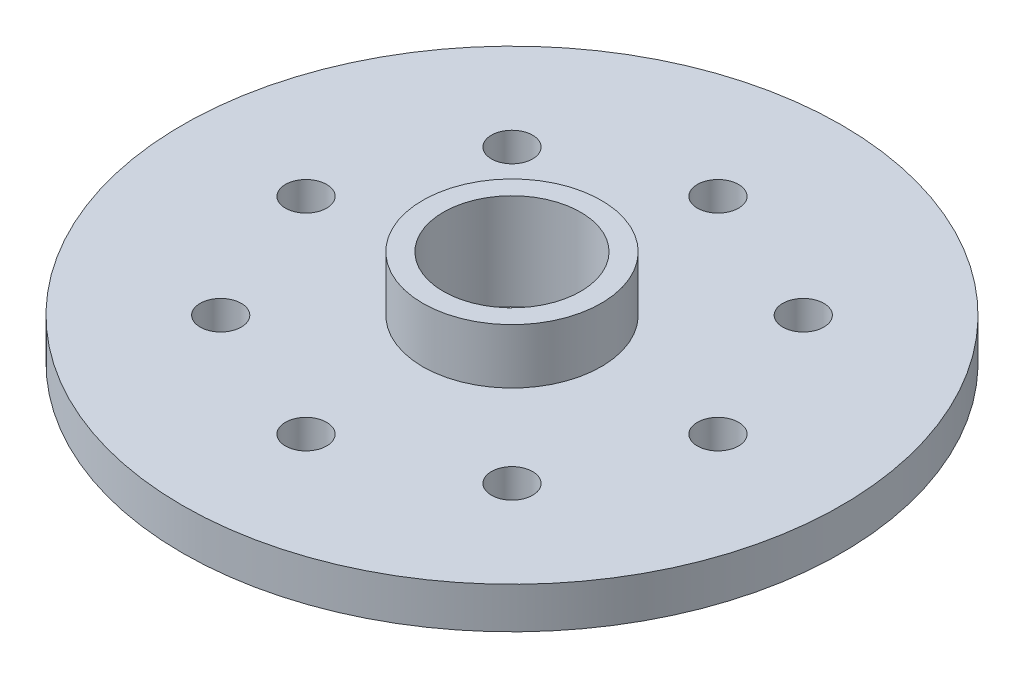
ISO-10303-21;
HEADER;
FILE_DESCRIPTION(('STEP AP214'),'2;1');
FILE_NAME('part.step','',(''),(''),'','','');
FILE_SCHEMA(('AUTOMOTIVE_DESIGN { 1 0 10303 214 1 1 1 1 }'));
ENDSEC;
DATA;
#1=APPLICATION_CONTEXT('core data for automotive mechanical design processes');
#2=APPLICATION_PROTOCOL_DEFINITION('international standard','automotive_design',2000,#1);
#3=PRODUCT_CONTEXT('',#1,'mechanical');
#4=PRODUCT('Part','Part','',(#3));
#5=PRODUCT_RELATED_PRODUCT_CATEGORY('part','',(#4));
#6=PRODUCT_DEFINITION_FORMATION('','',#4);
#7=PRODUCT_DEFINITION_CONTEXT('part definition',#1,'design');
#8=PRODUCT_DEFINITION('design','',#6,#7);
#9=PRODUCT_DEFINITION_SHAPE('','',#8);
#10=(LENGTH_UNIT() NAMED_UNIT(*) SI_UNIT(.MILLI.,.METRE.));
#11=(NAMED_UNIT(*) PLANE_ANGLE_UNIT() SI_UNIT($,.RADIAN.));
#12=(NAMED_UNIT(*) SI_UNIT($,.STERADIAN.) SOLID_ANGLE_UNIT());
#13=UNCERTAINTY_MEASURE_WITH_UNIT(LENGTH_MEASURE(1.E-05),#10,'distance_accuracy_value','');
#14=(GEOMETRIC_REPRESENTATION_CONTEXT(3) GLOBAL_UNCERTAINTY_ASSIGNED_CONTEXT((#13)) GLOBAL_UNIT_ASSIGNED_CONTEXT((#10,
#11,#12)) REPRESENTATION_CONTEXT('',''));
#15=CARTESIAN_POINT('',(0.,0.,0.));
#16=DIRECTION('',(0.,0.,1.));
#17=DIRECTION('',(1.,0.,0.));
#18=AXIS2_PLACEMENT_3D('',#15,#16,#17);
#19=CARTESIAN_POINT('',(0.,1.5,0.));
#20=DIRECTION('',(0.,-1.,0.));
#21=DIRECTION('',(0.,0.,-1.));
#22=AXIS2_PLACEMENT_3D('',#19,#20,#21);
#23=CYLINDRICAL_SURFACE('',#22,12.);
#24=CARTESIAN_POINT('',(0.,1.5,0.));
#25=DIRECTION('',(0.,1.,0.));
#26=DIRECTION('',(0.,0.,1.));
#27=AXIS2_PLACEMENT_3D('',#24,#25,#26);
#28=CIRCLE('',#27,12.);
#29=CARTESIAN_POINT('',(0.,1.5,12.));
#30=VERTEX_POINT('',#29);
#31=EDGE_CURVE('E10',#30,#30,#28,.T.);
#32=ORIENTED_EDGE('',*,*,#31,.F.);
#33=EDGE_LOOP('',(#32));
#34=FACE_BOUND('',#33,.T.);
#35=CARTESIAN_POINT('',(0.,0.,0.));
#36=DIRECTION('',(0.,1.,0.));
#37=DIRECTION('',(0.,0.,1.));
#38=AXIS2_PLACEMENT_3D('',#35,#36,#37);
#39=CIRCLE('',#38,12.);
#40=CARTESIAN_POINT('',(0.,0.,12.));
#41=VERTEX_POINT('',#40);
#42=EDGE_CURVE('E37',#41,#41,#39,.T.);
#43=ORIENTED_EDGE('',*,*,#42,.T.);
#44=EDGE_LOOP('',(#43));
#45=FACE_BOUND('',#44,.T.);
#46=ADVANCED_FACE('F30',(#34,#45),#23,.T.);
#47=CARTESIAN_POINT('',(0.,1.5,0.));
#48=DIRECTION('',(0.,1.,0.));
#49=DIRECTION('',(0.,0.,1.));
#50=AXIS2_PLACEMENT_3D('',#47,#48,#49);
#51=PLANE('',#50);
#52=CARTESIAN_POINT('',(5.3033008588992,1.5,-5.30330085889933));
#53=DIRECTION('',(0.,1.,0.));
#54=DIRECTION('',(0.,0.,1.));
#55=AXIS2_PLACEMENT_3D('',#52,#53,#54);
#56=CIRCLE('',#55,0.75);
#57=CARTESIAN_POINT('',(5.3033008588992,1.5,-4.55330085889933));
#58=VERTEX_POINT('',#57);
#59=EDGE_CURVE('E57',#58,#58,#56,.T.);
#60=ORIENTED_EDGE('',*,*,#59,.F.);
#61=EDGE_LOOP('',(#60));
#62=FACE_BOUND('',#61,.T.);
#63=CARTESIAN_POINT('',(7.50000000000032,1.5,-3.18825745992685E-13));
#64=DIRECTION('',(0.,1.,0.));
#65=DIRECTION('',(0.,0.,1.));
#66=AXIS2_PLACEMENT_3D('',#63,#64,#65);
#67=CIRCLE('',#66,0.749999999999999);
#68=CARTESIAN_POINT('',(7.50000000000032,1.5,0.74999999999968));
#69=VERTEX_POINT('',#68);
#70=EDGE_CURVE('E153',#69,#69,#67,.T.);
#71=ORIENTED_EDGE('',*,*,#70,.F.);
#72=EDGE_LOOP('',(#71));
#73=FACE_BOUND('',#72,.T.);
#74=CARTESIAN_POINT('',(5.30330085889965,1.5,5.30330085889888));
#75=DIRECTION('',(0.,1.,0.));
#76=DIRECTION('',(0.,0.,1.));
#77=AXIS2_PLACEMENT_3D('',#74,#75,#76);
#78=CIRCLE('',#77,0.749999999999999);
#79=CARTESIAN_POINT('',(5.30330085889965,1.5,6.05330085889888));
#80=VERTEX_POINT('',#79);
#81=EDGE_CURVE('E156',#80,#80,#78,.T.);
#82=ORIENTED_EDGE('',*,*,#81,.F.);
#83=EDGE_LOOP('',(#82));
#84=FACE_BOUND('',#83,.T.);
#85=CARTESIAN_POINT('',(6.37651491985369E-13,1.5,7.5));
#86=DIRECTION('',(0.,1.,0.));
#87=DIRECTION('',(0.,0.,1.));
#88=AXIS2_PLACEMENT_3D('',#85,#86,#87);
#89=CIRCLE('',#88,0.75);
#90=CARTESIAN_POINT('',(6.37651491985369E-13,1.5,8.25));
#91=VERTEX_POINT('',#90);
#92=EDGE_CURVE('E161',#91,#91,#89,.T.);
#93=ORIENTED_EDGE('',*,*,#92,.F.);
#94=EDGE_LOOP('',(#93));
#95=FACE_BOUND('',#94,.T.);
#96=CARTESIAN_POINT('',(-5.30330085889856,1.5,5.30330085889933));
#97=DIRECTION('',(0.,1.,0.));
#98=DIRECTION('',(0.,0.,1.));
#99=AXIS2_PLACEMENT_3D('',#96,#97,#98);
#100=CIRCLE('',#99,0.75);
#101=CARTESIAN_POINT('',(-5.30330085889856,1.5,6.05330085889933));
#102=VERTEX_POINT('',#101);
#103=EDGE_CURVE('E164',#102,#102,#100,.T.);
#104=ORIENTED_EDGE('',*,*,#103,.F.);
#105=EDGE_LOOP('',(#104));
#106=FACE_BOUND('',#105,.T.);
#107=CARTESIAN_POINT('',(-7.49999999999968,1.5,3.19744231092045E-13));
#108=DIRECTION('',(0.,1.,0.));
#109=DIRECTION('',(0.,0.,1.));
#110=AXIS2_PLACEMENT_3D('',#107,#108,#109);
#111=CIRCLE('',#110,0.749999999999999);
#112=CARTESIAN_POINT('',(-7.49999999999968,1.5,0.750000000000319));
#113=VERTEX_POINT('',#112);
#114=EDGE_CURVE('E166',#113,#113,#111,.T.);
#115=ORIENTED_EDGE('',*,*,#114,.F.);
#116=EDGE_LOOP('',(#115));
#117=FACE_BOUND('',#116,.T.);
#118=CARTESIAN_POINT('',(-5.30330085889901,1.5,-5.30330085889888));
#119=DIRECTION('',(0.,1.,0.));
#120=DIRECTION('',(0.,0.,1.));
#121=AXIS2_PLACEMENT_3D('',#118,#119,#120);
#122=CIRCLE('',#121,0.749999999999999);
#123=CARTESIAN_POINT('',(-5.30330085889901,1.5,-4.55330085889888));
#124=VERTEX_POINT('',#123);
#125=EDGE_CURVE('E81',#124,#124,#122,.T.);
#126=ORIENTED_EDGE('',*,*,#125,.F.);
#127=EDGE_LOOP('',(#126));
#128=FACE_BOUND('',#127,.T.);
#129=CARTESIAN_POINT('',(0.,1.5,-7.5));
#130=DIRECTION('',(0.,1.,0.));
#131=DIRECTION('',(0.,0.,1.));
#132=AXIS2_PLACEMENT_3D('',#129,#130,#131);
#133=CIRCLE('',#132,0.75);
#134=CARTESIAN_POINT('',(0.,1.5,-6.75));
#135=VERTEX_POINT('',#134);
#136=EDGE_CURVE('E52',#135,#135,#133,.T.);
#137=ORIENTED_EDGE('',*,*,#136,.F.);
#138=EDGE_LOOP('',(#137));
#139=FACE_BOUND('',#138,.T.);
#140=CARTESIAN_POINT('',(0.,1.5,0.));
#141=DIRECTION('',(0.,1.,0.));
#142=DIRECTION('',(0.,0.,1.));
#143=AXIS2_PLACEMENT_3D('',#140,#141,#142);
#144=CIRCLE('',#143,3.25);
#145=CARTESIAN_POINT('',(0.,1.5,3.25));
#146=VERTEX_POINT('',#145);
#147=EDGE_CURVE('E45',#146,#146,#144,.T.);
#148=ORIENTED_EDGE('',*,*,#147,.F.);
#149=EDGE_LOOP('',(#148));
#150=FACE_BOUND('',#149,.T.);
#151=ORIENTED_EDGE('',*,*,#31,.T.);
#152=EDGE_LOOP('',(#151));
#153=FACE_BOUND('',#152,.T.);
#154=ADVANCED_FACE('F95',(#62,#73,#84,#95,#106,#117,#128,#139,#150,#153),#51,.T.);
#155=CARTESIAN_POINT('',(0.,0.,0.));
#156=DIRECTION('',(0.,1.,0.));
#157=DIRECTION('',(0.,0.,1.));
#158=AXIS2_PLACEMENT_3D('',#155,#156,#157);
#159=PLANE('',#158);
#160=CARTESIAN_POINT('',(5.3033008588992,0.,-5.30330085889933));
#161=DIRECTION('',(0.,1.,0.));
#162=DIRECTION('',(0.,0.,1.));
#163=AXIS2_PLACEMENT_3D('',#160,#161,#162);
#164=CIRCLE('',#163,0.75);
#165=CARTESIAN_POINT('',(5.3033008588992,0.,-4.55330085889933));
#166=VERTEX_POINT('',#165);
#167=EDGE_CURVE('E33',#166,#166,#164,.T.);
#168=ORIENTED_EDGE('',*,*,#167,.T.);
#169=EDGE_LOOP('',(#168));
#170=FACE_BOUND('',#169,.T.);
#171=CARTESIAN_POINT('',(7.50000000000032,0.,-3.18825745992685E-13));
#172=DIRECTION('',(0.,1.,0.));
#173=DIRECTION('',(0.,0.,1.));
#174=AXIS2_PLACEMENT_3D('',#171,#172,#173);
#175=CIRCLE('',#174,0.749999999999999);
#176=CARTESIAN_POINT('',(7.50000000000032,0.,0.74999999999968));
#177=VERTEX_POINT('',#176);
#178=EDGE_CURVE('E68',#177,#177,#175,.T.);
#179=ORIENTED_EDGE('',*,*,#178,.T.);
#180=EDGE_LOOP('',(#179));
#181=FACE_BOUND('',#180,.T.);
#182=CARTESIAN_POINT('',(5.30330085889965,0.,5.30330085889888));
#183=DIRECTION('',(0.,1.,0.));
#184=DIRECTION('',(0.,0.,1.));
#185=AXIS2_PLACEMENT_3D('',#182,#183,#184);
#186=CIRCLE('',#185,0.749999999999999);
#187=CARTESIAN_POINT('',(5.30330085889965,0.,6.05330085889888));
#188=VERTEX_POINT('',#187);
#189=EDGE_CURVE('E66',#188,#188,#186,.T.);
#190=ORIENTED_EDGE('',*,*,#189,.T.);
#191=EDGE_LOOP('',(#190));
#192=FACE_BOUND('',#191,.T.);
#193=CARTESIAN_POINT('',(6.37651491985369E-13,0.,7.5));
#194=DIRECTION('',(0.,1.,0.));
#195=DIRECTION('',(0.,0.,1.));
#196=AXIS2_PLACEMENT_3D('',#193,#194,#195);
#197=CIRCLE('',#196,0.75);
#198=CARTESIAN_POINT('',(6.37651491985369E-13,0.,8.25));
#199=VERTEX_POINT('',#198);
#200=EDGE_CURVE('E63',#199,#199,#197,.T.);
#201=ORIENTED_EDGE('',*,*,#200,.T.);
#202=EDGE_LOOP('',(#201));
#203=FACE_BOUND('',#202,.T.);
#204=CARTESIAN_POINT('',(-5.30330085889856,0.,5.30330085889933));
#205=DIRECTION('',(0.,1.,0.));
#206=DIRECTION('',(0.,0.,1.));
#207=AXIS2_PLACEMENT_3D('',#204,#205,#206);
#208=CIRCLE('',#207,0.75);
#209=CARTESIAN_POINT('',(-5.30330085889856,0.,6.05330085889933));
#210=VERTEX_POINT('',#209);
#211=EDGE_CURVE('E60',#210,#210,#208,.T.);
#212=ORIENTED_EDGE('',*,*,#211,.T.);
#213=EDGE_LOOP('',(#212));
#214=FACE_BOUND('',#213,.T.);
#215=CARTESIAN_POINT('',(-7.49999999999968,0.,3.19744231092045E-13));
#216=DIRECTION('',(0.,1.,0.));
#217=DIRECTION('',(0.,0.,1.));
#218=AXIS2_PLACEMENT_3D('',#215,#216,#217);
#219=CIRCLE('',#218,0.749999999999999);
#220=CARTESIAN_POINT('',(-7.49999999999968,0.,0.750000000000319));
#221=VERTEX_POINT('',#220);
#222=EDGE_CURVE('E56',#221,#221,#219,.T.);
#223=ORIENTED_EDGE('',*,*,#222,.T.);
#224=EDGE_LOOP('',(#223));
#225=FACE_BOUND('',#224,.T.);
#226=CARTESIAN_POINT('',(-5.30330085889901,0.,-5.30330085889888));
#227=DIRECTION('',(0.,1.,0.));
#228=DIRECTION('',(0.,0.,1.));
#229=AXIS2_PLACEMENT_3D('',#226,#227,#228);
#230=CIRCLE('',#229,0.749999999999999);
#231=CARTESIAN_POINT('',(-5.30330085889901,0.,-4.55330085889888));
#232=VERTEX_POINT('',#231);
#233=EDGE_CURVE('E53',#232,#232,#230,.T.);
#234=ORIENTED_EDGE('',*,*,#233,.T.);
#235=EDGE_LOOP('',(#234));
#236=FACE_BOUND('',#235,.T.);
#237=CARTESIAN_POINT('',(0.,0.,-7.5));
#238=DIRECTION('',(0.,1.,0.));
#239=DIRECTION('',(0.,0.,1.));
#240=AXIS2_PLACEMENT_3D('',#237,#238,#239);
#241=CIRCLE('',#240,0.75);
#242=CARTESIAN_POINT('',(0.,0.,-6.75));
#243=VERTEX_POINT('',#242);
#244=EDGE_CURVE('E48',#243,#243,#241,.T.);
#245=ORIENTED_EDGE('',*,*,#244,.T.);
#246=EDGE_LOOP('',(#245));
#247=FACE_BOUND('',#246,.T.);
#248=CARTESIAN_POINT('',(0.,0.,0.));
#249=DIRECTION('',(0.,1.,0.));
#250=DIRECTION('',(0.,0.,1.));
#251=AXIS2_PLACEMENT_3D('',#248,#249,#250);
#252=CIRCLE('',#251,2.5);
#253=CARTESIAN_POINT('',(0.,0.,2.5));
#254=VERTEX_POINT('',#253);
#255=EDGE_CURVE('E83',#254,#254,#252,.T.);
#256=ORIENTED_EDGE('',*,*,#255,.T.);
#257=EDGE_LOOP('',(#256));
#258=FACE_BOUND('',#257,.T.);
#259=ORIENTED_EDGE('',*,*,#42,.F.);
#260=EDGE_LOOP('',(#259));
#261=FACE_BOUND('',#260,.T.);
#262=ADVANCED_FACE('F97',(#170,#181,#192,#203,#214,#225,#236,#247,#258,#261),#159,.F.);
#263=CARTESIAN_POINT('',(0.,3.5,0.));
#264=DIRECTION('',(0.,-1.,0.));
#265=DIRECTION('',(0.,0.,-1.));
#266=AXIS2_PLACEMENT_3D('',#263,#264,#265);
#267=CYLINDRICAL_SURFACE('',#266,3.25);
#268=CARTESIAN_POINT('',(0.,3.5,0.));
#269=DIRECTION('',(0.,1.,0.));
#270=DIRECTION('',(0.,0.,1.));
#271=AXIS2_PLACEMENT_3D('',#268,#269,#270);
#272=CIRCLE('',#271,3.25);
#273=CARTESIAN_POINT('',(0.,3.5,3.25));
#274=VERTEX_POINT('',#273);
#275=EDGE_CURVE('E42',#274,#274,#272,.T.);
#276=ORIENTED_EDGE('',*,*,#275,.F.);
#277=EDGE_LOOP('',(#276));
#278=FACE_BOUND('',#277,.T.);
#279=ORIENTED_EDGE('',*,*,#147,.T.);
#280=EDGE_LOOP('',(#279));
#281=FACE_BOUND('',#280,.T.);
#282=ADVANCED_FACE('F93',(#278,#281),#267,.T.);
#283=CARTESIAN_POINT('',(0.,3.5,0.));
#284=DIRECTION('',(0.,1.,0.));
#285=DIRECTION('',(0.,0.,1.));
#286=AXIS2_PLACEMENT_3D('',#283,#284,#285);
#287=PLANE('',#286);
#288=CARTESIAN_POINT('',(0.,3.5,0.));
#289=DIRECTION('',(0.,1.,0.));
#290=DIRECTION('',(0.,0.,1.));
#291=AXIS2_PLACEMENT_3D('',#288,#289,#290);
#292=CIRCLE('',#291,2.5);
#293=CARTESIAN_POINT('',(0.,3.5,2.5));
#294=VERTEX_POINT('',#293);
#295=EDGE_CURVE('E51',#294,#294,#292,.T.);
#296=ORIENTED_EDGE('',*,*,#295,.F.);
#297=EDGE_LOOP('',(#296));
#298=FACE_BOUND('',#297,.T.);
#299=ORIENTED_EDGE('',*,*,#275,.T.);
#300=EDGE_LOOP('',(#299));
#301=FACE_BOUND('',#300,.T.);
#302=ADVANCED_FACE('F110',(#298,#301),#287,.T.);
#303=CARTESIAN_POINT('',(0.,0.,0.));
#304=DIRECTION('',(0.,1.,0.));
#305=DIRECTION('',(0.,0.,1.));
#306=AXIS2_PLACEMENT_3D('',#303,#304,#305);
#307=CYLINDRICAL_SURFACE('',#306,2.5);
#308=ORIENTED_EDGE('',*,*,#255,.F.);
#309=EDGE_LOOP('',(#308));
#310=FACE_BOUND('',#309,.T.);
#311=ORIENTED_EDGE('',*,*,#295,.T.);
#312=EDGE_LOOP('',(#311));
#313=FACE_BOUND('',#312,.T.);
#314=ADVANCED_FACE('F114',(#310,#313),#307,.F.);
#315=CARTESIAN_POINT('',(0.,-0.5,-7.5));
#316=DIRECTION('',(0.,1.,0.));
#317=DIRECTION('',(0.,0.,1.));
#318=AXIS2_PLACEMENT_3D('',#315,#316,#317);
#319=CYLINDRICAL_SURFACE('',#318,0.75);
#320=ORIENTED_EDGE('',*,*,#136,.T.);
#321=EDGE_LOOP('',(#320));
#322=FACE_BOUND('',#321,.T.);
#323=ORIENTED_EDGE('',*,*,#244,.F.);
#324=EDGE_LOOP('',(#323));
#325=FACE_BOUND('',#324,.T.);
#326=ADVANCED_FACE('F118',(#322,#325),#319,.F.);
#327=CARTESIAN_POINT('',(-5.30330085889901,-0.5,-5.30330085889888));
#328=DIRECTION('',(0.,1.,0.));
#329=DIRECTION('',(0.,0.,1.));
#330=AXIS2_PLACEMENT_3D('',#327,#328,#329);
#331=CYLINDRICAL_SURFACE('',#330,0.749999999999999);
#332=ORIENTED_EDGE('',*,*,#125,.T.);
#333=EDGE_LOOP('',(#332));
#334=FACE_BOUND('',#333,.T.);
#335=ORIENTED_EDGE('',*,*,#233,.F.);
#336=EDGE_LOOP('',(#335));
#337=FACE_BOUND('',#336,.T.);
#338=ADVANCED_FACE('F122',(#334,#337),#331,.F.);
#339=CARTESIAN_POINT('',(-7.49999999999968,-0.5,3.19744231092045E-13));
#340=DIRECTION('',(0.,1.,0.));
#341=DIRECTION('',(0.,0.,1.));
#342=AXIS2_PLACEMENT_3D('',#339,#340,#341);
#343=CYLINDRICAL_SURFACE('',#342,0.749999999999999);
#344=ORIENTED_EDGE('',*,*,#114,.T.);
#345=EDGE_LOOP('',(#344));
#346=FACE_BOUND('',#345,.T.);
#347=ORIENTED_EDGE('',*,*,#222,.F.);
#348=EDGE_LOOP('',(#347));
#349=FACE_BOUND('',#348,.T.);
#350=ADVANCED_FACE('F125',(#346,#349),#343,.F.);
#351=CARTESIAN_POINT('',(-5.30330085889856,-0.5,5.30330085889933));
#352=DIRECTION('',(0.,1.,0.));
#353=DIRECTION('',(0.,0.,1.));
#354=AXIS2_PLACEMENT_3D('',#351,#352,#353);
#355=CYLINDRICAL_SURFACE('',#354,0.75);
#356=ORIENTED_EDGE('',*,*,#103,.T.);
#357=EDGE_LOOP('',(#356));
#358=FACE_BOUND('',#357,.T.);
#359=ORIENTED_EDGE('',*,*,#211,.F.);
#360=EDGE_LOOP('',(#359));
#361=FACE_BOUND('',#360,.T.);
#362=ADVANCED_FACE('F129',(#358,#361),#355,.F.);
#363=CARTESIAN_POINT('',(6.37651491985369E-13,-0.5,7.5));
#364=DIRECTION('',(0.,1.,0.));
#365=DIRECTION('',(0.,0.,1.));
#366=AXIS2_PLACEMENT_3D('',#363,#364,#365);
#367=CYLINDRICAL_SURFACE('',#366,0.75);
#368=ORIENTED_EDGE('',*,*,#92,.T.);
#369=EDGE_LOOP('',(#368));
#370=FACE_BOUND('',#369,.T.);
#371=ORIENTED_EDGE('',*,*,#200,.F.);
#372=EDGE_LOOP('',(#371));
#373=FACE_BOUND('',#372,.T.);
#374=ADVANCED_FACE('F133',(#370,#373),#367,.F.);
#375=CARTESIAN_POINT('',(5.30330085889965,-0.5,5.30330085889888));
#376=DIRECTION('',(0.,1.,0.));
#377=DIRECTION('',(0.,0.,1.));
#378=AXIS2_PLACEMENT_3D('',#375,#376,#377);
#379=CYLINDRICAL_SURFACE('',#378,0.749999999999999);
#380=ORIENTED_EDGE('',*,*,#81,.T.);
#381=EDGE_LOOP('',(#380));
#382=FACE_BOUND('',#381,.T.);
#383=ORIENTED_EDGE('',*,*,#189,.F.);
#384=EDGE_LOOP('',(#383));
#385=FACE_BOUND('',#384,.T.);
#386=ADVANCED_FACE('F137',(#382,#385),#379,.F.);
#387=CARTESIAN_POINT('',(7.50000000000032,-0.5,-3.18825745992685E-13));
#388=DIRECTION('',(0.,1.,0.));
#389=DIRECTION('',(0.,0.,1.));
#390=AXIS2_PLACEMENT_3D('',#387,#388,#389);
#391=CYLINDRICAL_SURFACE('',#390,0.749999999999999);
#392=ORIENTED_EDGE('',*,*,#70,.T.);
#393=EDGE_LOOP('',(#392));
#394=FACE_BOUND('',#393,.T.);
#395=ORIENTED_EDGE('',*,*,#178,.F.);
#396=EDGE_LOOP('',(#395));
#397=FACE_BOUND('',#396,.T.);
#398=ADVANCED_FACE('F141',(#394,#397),#391,.F.);
#399=CARTESIAN_POINT('',(5.3033008588992,-0.5,-5.30330085889933));
#400=DIRECTION('',(0.,1.,0.));
#401=DIRECTION('',(0.,0.,1.));
#402=AXIS2_PLACEMENT_3D('',#399,#400,#401);
#403=CYLINDRICAL_SURFACE('',#402,0.75);
#404=ORIENTED_EDGE('',*,*,#59,.T.);
#405=EDGE_LOOP('',(#404));
#406=FACE_BOUND('',#405,.T.);
#407=ORIENTED_EDGE('',*,*,#167,.F.);
#408=EDGE_LOOP('',(#407));
#409=FACE_BOUND('',#408,.T.);
#410=ADVANCED_FACE('F145',(#406,#409),#403,.F.);
#411=CLOSED_SHELL('',(#46,#154,#262,#282,#302,#314,#326,#338,#350,#362,#374,#386,#398,#410));
#412=MANIFOLD_SOLID_BREP('B2',#411);
#413=ADVANCED_BREP_SHAPE_REPRESENTATION('',(#18,#412),#14);
#414=SHAPE_DEFINITION_REPRESENTATION(#9,#413);
ENDSEC;
END-ISO-10303-21;
